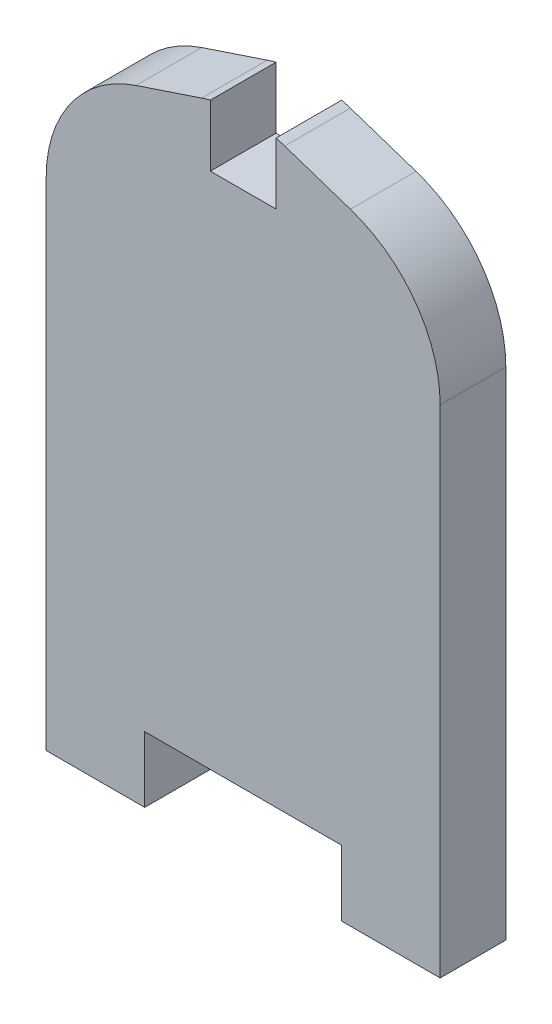
ISO-10303-21;
HEADER;
FILE_DESCRIPTION(('STEP AP214'),'2;1');
FILE_NAME('part.step','',(''),(''),'','','');
FILE_SCHEMA(('AUTOMOTIVE_DESIGN { 1 0 10303 214 1 1 1 1 }'));
ENDSEC;
DATA;
#1=APPLICATION_CONTEXT('core data for automotive mechanical design processes');
#2=APPLICATION_PROTOCOL_DEFINITION('international standard','automotive_design',2000,#1);
#3=PRODUCT_CONTEXT('',#1,'mechanical');
#4=PRODUCT('Part','Part','',(#3));
#5=PRODUCT_RELATED_PRODUCT_CATEGORY('part','',(#4));
#6=PRODUCT_DEFINITION_FORMATION('','',#4);
#7=PRODUCT_DEFINITION_CONTEXT('part definition',#1,'design');
#8=PRODUCT_DEFINITION('design','',#6,#7);
#9=PRODUCT_DEFINITION_SHAPE('','',#8);
#10=(LENGTH_UNIT() NAMED_UNIT(*) SI_UNIT(.MILLI.,.METRE.));
#11=(NAMED_UNIT(*) PLANE_ANGLE_UNIT() SI_UNIT($,.RADIAN.));
#12=(NAMED_UNIT(*) SI_UNIT($,.STERADIAN.) SOLID_ANGLE_UNIT());
#13=UNCERTAINTY_MEASURE_WITH_UNIT(LENGTH_MEASURE(1.E-05),#10,'distance_accuracy_value','');
#14=(GEOMETRIC_REPRESENTATION_CONTEXT(3) GLOBAL_UNCERTAINTY_ASSIGNED_CONTEXT((#13)) GLOBAL_UNIT_ASSIGNED_CONTEXT((#10,
#11,#12)) REPRESENTATION_CONTEXT('',''));
#15=CARTESIAN_POINT('',(0.,0.,0.));
#16=DIRECTION('',(0.,0.,1.));
#17=DIRECTION('',(1.,0.,0.));
#18=AXIS2_PLACEMENT_3D('',#15,#16,#17);
#19=CARTESIAN_POINT('',(0.,5.79395318214315,6.35));
#20=DIRECTION('',(0.,0.,-1.));
#21=DIRECTION('',(-1.,0.,0.));
#22=AXIS2_PLACEMENT_3D('',#19,#20,#21);
#23=CYLINDRICAL_SURFACE('',#22,12.7);
#24=DIRECTION('',(0.,0.,-1.));
#25=VECTOR('',#24,1.);
#26=CARTESIAN_POINT('',(3.175,18.0906753063517,6.35));
#27=LINE('',#26,#25);
#28=CARTESIAN_POINT('',(3.175,18.0906753063517,6.35));
#29=VERTEX_POINT('',#28);
#30=CARTESIAN_POINT('',(3.175,18.0906753063517,0.));
#31=VERTEX_POINT('',#30);
#32=EDGE_CURVE('E11',#29,#31,#27,.T.);
#33=ORIENTED_EDGE('',*,*,#32,.F.);
#34=CARTESIAN_POINT('',(0.,5.79395318214315,6.35));
#35=DIRECTION('',(0.,0.,1.));
#36=DIRECTION('',(1.,0.,0.));
#37=AXIS2_PLACEMENT_3D('',#34,#35,#36);
#38=CIRCLE('',#37,12.7);
#39=CARTESIAN_POINT('',(4.01609262841383,17.8422310673847,6.35));
#40=VERTEX_POINT('',#39);
#41=EDGE_CURVE('E294',#40,#29,#38,.T.);
#42=ORIENTED_EDGE('',*,*,#41,.F.);
#43=DIRECTION('',(0.,0.,-1.));
#44=VECTOR('',#43,1.);
#45=CARTESIAN_POINT('',(4.01609262841383,17.8422310673847,6.35));
#46=LINE('',#45,#44);
#47=CARTESIAN_POINT('',(4.01609262841383,17.8422310673847,0.));
#48=VERTEX_POINT('',#47);
#49=EDGE_CURVE('E274',#48,#40,#46,.F.);
#50=ORIENTED_EDGE('',*,*,#49,.F.);
#51=CARTESIAN_POINT('',(0.,5.79395318214315,0.));
#52=DIRECTION('',(0.,0.,1.));
#53=DIRECTION('',(1.,0.,0.));
#54=AXIS2_PLACEMENT_3D('',#51,#52,#53);
#55=CIRCLE('',#54,12.7);
#56=EDGE_CURVE('E281',#31,#48,#55,.F.);
#57=ORIENTED_EDGE('',*,*,#56,.F.);
#58=EDGE_LOOP('',(#33,#42,#50,#57));
#59=FACE_BOUND('',#58,.T.);
#60=ADVANCED_FACE('F39',(#59),#23,.T.);
#61=CARTESIAN_POINT('',(-19.05,-44.3190713898107,6.35));
#62=DIRECTION('',(0.,1.,0.));
#63=DIRECTION('',(0.,0.,1.));
#64=AXIS2_PLACEMENT_3D('',#61,#62,#63);
#65=PLANE('',#64);
#66=DIRECTION('',(1.,0.,0.));
#67=VECTOR('',#66,1.);
#68=CARTESIAN_POINT('',(-19.05,-44.3190713898107,0.));
#69=LINE('',#68,#67);
#70=CARTESIAN_POINT('',(-19.05,-44.3190713898107,0.));
#71=VERTEX_POINT('',#70);
#72=CARTESIAN_POINT('',(-9.52499999999999,-44.3190713898107,0.));
#73=VERTEX_POINT('',#72);
#74=EDGE_CURVE('E191',#71,#73,#69,.T.);
#75=ORIENTED_EDGE('',*,*,#74,.T.);
#76=DIRECTION('',(0.,0.,-1.));
#77=VECTOR('',#76,1.);
#78=CARTESIAN_POINT('',(-9.52499999999999,-44.3190713898107,6.35));
#79=LINE('',#78,#77);
#80=CARTESIAN_POINT('',(-9.52499999999999,-44.3190713898107,6.35));
#81=VERTEX_POINT('',#80);
#82=EDGE_CURVE('E266',#81,#73,#79,.T.);
#83=ORIENTED_EDGE('',*,*,#82,.F.);
#84=DIRECTION('',(1.,0.,0.));
#85=VECTOR('',#84,1.);
#86=CARTESIAN_POINT('',(-19.05,-44.3190713898107,6.35));
#87=LINE('',#86,#85);
#88=CARTESIAN_POINT('',(-19.05,-44.3190713898107,6.35));
#89=VERTEX_POINT('',#88);
#90=EDGE_CURVE('E195',#89,#81,#87,.T.);
#91=ORIENTED_EDGE('',*,*,#90,.F.);
#92=DIRECTION('',(0.,0.,-1.));
#93=VECTOR('',#92,1.);
#94=CARTESIAN_POINT('',(-19.05,-44.3190713898107,6.35));
#95=LINE('',#94,#93);
#96=EDGE_CURVE('E270',#89,#71,#95,.T.);
#97=ORIENTED_EDGE('',*,*,#96,.T.);
#98=EDGE_LOOP('',(#75,#83,#91,#97));
#99=FACE_BOUND('',#98,.T.);
#100=ADVANCED_FACE('F365',(#99),#65,.F.);
#101=CARTESIAN_POINT('',(-9.52499999999999,-37.9690713898107,6.35));
#102=DIRECTION('',(-1.,0.,0.));
#103=DIRECTION('',(0.,0.,1.));
#104=AXIS2_PLACEMENT_3D('',#101,#102,#103);
#105=PLANE('',#104);
#106=DIRECTION('',(0.,1.,0.));
#107=VECTOR('',#106,1.);
#108=CARTESIAN_POINT('',(-9.52499999999999,-37.9690713898107,0.));
#109=LINE('',#108,#107);
#110=CARTESIAN_POINT('',(-9.52499999999999,-37.9690713898107,0.));
#111=VERTEX_POINT('',#110);
#112=EDGE_CURVE('E225',#73,#111,#109,.T.);
#113=ORIENTED_EDGE('',*,*,#112,.T.);
#114=DIRECTION('',(0.,0.,-1.));
#115=VECTOR('',#114,1.);
#116=CARTESIAN_POINT('',(-9.52499999999999,-37.9690713898107,6.35));
#117=LINE('',#116,#115);
#118=CARTESIAN_POINT('',(-9.52499999999999,-37.9690713898107,6.35));
#119=VERTEX_POINT('',#118);
#120=EDGE_CURVE('E262',#119,#111,#117,.T.);
#121=ORIENTED_EDGE('',*,*,#120,.F.);
#122=DIRECTION('',(0.,1.,0.));
#123=VECTOR('',#122,1.);
#124=CARTESIAN_POINT('',(-9.52499999999999,-37.9690713898107,6.35));
#125=LINE('',#124,#123);
#126=EDGE_CURVE('E199',#81,#119,#125,.T.);
#127=ORIENTED_EDGE('',*,*,#126,.F.);
#128=ORIENTED_EDGE('',*,*,#82,.T.);
#129=EDGE_LOOP('',(#113,#121,#127,#128));
#130=FACE_BOUND('',#129,.T.);
#131=ADVANCED_FACE('F358',(#130),#105,.F.);
#132=CARTESIAN_POINT('',(-9.52499999999999,-37.9690713898107,6.35));
#133=DIRECTION('',(0.,1.,0.));
#134=DIRECTION('',(0.,0.,1.));
#135=AXIS2_PLACEMENT_3D('',#132,#133,#134);
#136=PLANE('',#135);
#137=DIRECTION('',(1.,0.,0.));
#138=VECTOR('',#137,1.);
#139=CARTESIAN_POINT('',(-9.52499999999999,-37.9690713898107,0.));
#140=LINE('',#139,#138);
#141=CARTESIAN_POINT('',(9.525,-37.9690713898107,0.));
#142=VERTEX_POINT('',#141);
#143=EDGE_CURVE('E228',#111,#142,#140,.T.);
#144=ORIENTED_EDGE('',*,*,#143,.T.);
#145=DIRECTION('',(0.,0.,-1.));
#146=VECTOR('',#145,1.);
#147=CARTESIAN_POINT('',(9.525,-37.9690713898107,6.35));
#148=LINE('',#147,#146);
#149=CARTESIAN_POINT('',(9.525,-37.9690713898107,6.35));
#150=VERTEX_POINT('',#149);
#151=EDGE_CURVE('E258',#150,#142,#148,.T.);
#152=ORIENTED_EDGE('',*,*,#151,.F.);
#153=DIRECTION('',(1.,0.,0.));
#154=VECTOR('',#153,1.);
#155=CARTESIAN_POINT('',(-9.52499999999999,-37.9690713898107,6.35));
#156=LINE('',#155,#154);
#157=EDGE_CURVE('E202',#119,#150,#156,.T.);
#158=ORIENTED_EDGE('',*,*,#157,.F.);
#159=ORIENTED_EDGE('',*,*,#120,.T.);
#160=EDGE_LOOP('',(#144,#152,#158,#159));
#161=FACE_BOUND('',#160,.T.);
#162=ADVANCED_FACE('F354',(#161),#136,.F.);
#163=CARTESIAN_POINT('',(9.525,-37.9690713898107,6.35));
#164=DIRECTION('',(1.,0.,0.));
#165=DIRECTION('',(0.,0.,-1.));
#166=AXIS2_PLACEMENT_3D('',#163,#164,#165);
#167=PLANE('',#166);
#168=DIRECTION('',(0.,-1.,0.));
#169=VECTOR('',#168,1.);
#170=CARTESIAN_POINT('',(9.525,-37.9690713898107,0.));
#171=LINE('',#170,#169);
#172=CARTESIAN_POINT('',(9.525,-44.3190713898107,0.));
#173=VERTEX_POINT('',#172);
#174=EDGE_CURVE('E231',#142,#173,#171,.T.);
#175=ORIENTED_EDGE('',*,*,#174,.T.);
#176=DIRECTION('',(0.,0.,-1.));
#177=VECTOR('',#176,1.);
#178=CARTESIAN_POINT('',(9.525,-44.3190713898107,6.35));
#179=LINE('',#178,#177);
#180=CARTESIAN_POINT('',(9.525,-44.3190713898107,6.35));
#181=VERTEX_POINT('',#180);
#182=EDGE_CURVE('E254',#181,#173,#179,.T.);
#183=ORIENTED_EDGE('',*,*,#182,.F.);
#184=DIRECTION('',(0.,-1.,0.));
#185=VECTOR('',#184,1.);
#186=CARTESIAN_POINT('',(9.525,-37.9690713898107,6.35));
#187=LINE('',#186,#185);
#188=EDGE_CURVE('E205',#150,#181,#187,.T.);
#189=ORIENTED_EDGE('',*,*,#188,.F.);
#190=ORIENTED_EDGE('',*,*,#151,.T.);
#191=EDGE_LOOP('',(#175,#183,#189,#190));
#192=FACE_BOUND('',#191,.T.);
#193=ADVANCED_FACE('F349',(#192),#167,.F.);
#194=CARTESIAN_POINT('',(19.05,-44.3190713898107,6.35));
#195=DIRECTION('',(0.,1.,0.));
#196=DIRECTION('',(-1.,0.,0.));
#197=AXIS2_PLACEMENT_3D('',#194,#195,#196);
#198=PLANE('',#197);
#199=DIRECTION('',(1.,0.,0.));
#200=VECTOR('',#199,1.);
#201=CARTESIAN_POINT('',(19.05,-44.3190713898107,0.));
#202=LINE('',#201,#200);
#203=CARTESIAN_POINT('',(19.05,-44.3190713898107,0.));
#204=VERTEX_POINT('',#203);
#205=EDGE_CURVE('E234',#173,#204,#202,.T.);
#206=ORIENTED_EDGE('',*,*,#205,.T.);
#207=DIRECTION('',(0.,0.,-1.));
#208=VECTOR('',#207,1.);
#209=CARTESIAN_POINT('',(19.05,-44.3190713898107,6.35));
#210=LINE('',#209,#208);
#211=CARTESIAN_POINT('',(19.05,-44.3190713898107,6.35));
#212=VERTEX_POINT('',#211);
#213=EDGE_CURVE('E222',#212,#204,#210,.T.);
#214=ORIENTED_EDGE('',*,*,#213,.F.);
#215=DIRECTION('',(1.,0.,0.));
#216=VECTOR('',#215,1.);
#217=CARTESIAN_POINT('',(19.05,-44.3190713898107,6.35));
#218=LINE('',#217,#216);
#219=EDGE_CURVE('E208',#181,#212,#218,.T.);
#220=ORIENTED_EDGE('',*,*,#219,.F.);
#221=ORIENTED_EDGE('',*,*,#182,.T.);
#222=EDGE_LOOP('',(#206,#214,#220,#221));
#223=FACE_BOUND('',#222,.T.);
#224=ADVANCED_FACE('F343',(#223),#198,.F.);
#225=CARTESIAN_POINT('',(19.05,-37.9690713898107,6.35));
#226=DIRECTION('',(-1.,0.,0.));
#227=DIRECTION('',(0.,-1.,0.));
#228=AXIS2_PLACEMENT_3D('',#225,#226,#227);
#229=PLANE('',#228);
#230=DIRECTION('',(0.,1.,0.));
#231=VECTOR('',#230,1.);
#232=CARTESIAN_POINT('',(19.05,-37.9690713898107,0.));
#233=LINE('',#232,#231);
#234=CARTESIAN_POINT('',(19.05,3.67728651547648,0.));
#235=VERTEX_POINT('',#234);
#236=EDGE_CURVE('E238',#204,#235,#233,.T.);
#237=ORIENTED_EDGE('',*,*,#236,.T.);
#238=DIRECTION('',(0.,0.,-1.));
#239=VECTOR('',#238,1.);
#240=CARTESIAN_POINT('',(19.05,3.67728651547648,6.35));
#241=LINE('',#240,#239);
#242=CARTESIAN_POINT('',(19.0499999999999,3.67728651547647,6.35));
#243=VERTEX_POINT('',#242);
#244=EDGE_CURVE('E290',#235,#243,#241,.F.);
#245=ORIENTED_EDGE('',*,*,#244,.T.);
#246=DIRECTION('',(0.,1.,0.));
#247=VECTOR('',#246,1.);
#248=CARTESIAN_POINT('',(19.05,-37.9690713898107,6.35));
#249=LINE('',#248,#247);
#250=EDGE_CURVE('E211',#212,#243,#249,.T.);
#251=ORIENTED_EDGE('',*,*,#250,.F.);
#252=ORIENTED_EDGE('',*,*,#213,.T.);
#253=EDGE_LOOP('',(#237,#245,#251,#252));
#254=FACE_BOUND('',#253,.T.);
#255=ADVANCED_FACE('F338',(#254),#229,.F.);
#256=CARTESIAN_POINT('',(0.,19.1809286101893,6.35));
#257=DIRECTION('',(-0.316227766016838,-0.948683298050514,0.));
#258=DIRECTION('',(0.948683298050514,-0.316227766016838,0.));
#259=AXIS2_PLACEMENT_3D('',#256,#257,#258);
#260=PLANE('',#259);
#261=DIRECTION('',(-0.948683298050514,0.316227766016838,0.));
#262=VECTOR('',#261,1.);
#263=CARTESIAN_POINT('',(0.,19.1809286101893,6.35));
#264=LINE('',#263,#262);
#265=CARTESIAN_POINT('',(10.3660926284138,15.725564400718,6.35));
#266=VERTEX_POINT('',#265);
#267=EDGE_CURVE('E215',#266,#40,#264,.T.);
#268=ORIENTED_EDGE('',*,*,#267,.F.);
#269=DIRECTION('',(0.,0.,-1.));
#270=VECTOR('',#269,1.);
#271=CARTESIAN_POINT('',(10.3660926284138,15.725564400718,6.35));
#272=LINE('',#271,#270);
#273=CARTESIAN_POINT('',(10.3660926284138,15.725564400718,0.));
#274=VERTEX_POINT('',#273);
#275=EDGE_CURVE('E277',#266,#274,#272,.T.);
#276=ORIENTED_EDGE('',*,*,#275,.T.);
#277=DIRECTION('',(-0.948683298050514,0.316227766016838,0.));
#278=VECTOR('',#277,1.);
#279=CARTESIAN_POINT('',(0.,19.1809286101893,0.));
#280=LINE('',#279,#278);
#281=EDGE_CURVE('E242',#274,#48,#280,.T.);
#282=ORIENTED_EDGE('',*,*,#281,.T.);
#283=ORIENTED_EDGE('',*,*,#49,.T.);
#284=EDGE_LOOP('',(#268,#276,#282,#283));
#285=FACE_BOUND('',#284,.T.);
#286=ADVANCED_FACE('F329',(#285),#260,.F.);
#287=CARTESIAN_POINT('',(-19.05,12.8309286101893,6.35));
#288=DIRECTION('',(0.316227766016838,-0.948683298050514,0.));
#289=DIRECTION('',(0.948683298050514,0.316227766016838,0.));
#290=AXIS2_PLACEMENT_3D('',#287,#288,#289);
#291=PLANE('',#290);
#292=DIRECTION('',(-0.948683298050514,-0.316227766016838,0.));
#293=VECTOR('',#292,1.);
#294=CARTESIAN_POINT('',(-19.05,12.8309286101893,0.));
#295=LINE('',#294,#293);
#296=CARTESIAN_POINT('',(-4.01609262841385,17.8422310673847,0.));
#297=VERTEX_POINT('',#296);
#298=CARTESIAN_POINT('',(-10.3660926284138,15.725564400718,0.));
#299=VERTEX_POINT('',#298);
#300=EDGE_CURVE('E246',#297,#299,#295,.T.);
#301=ORIENTED_EDGE('',*,*,#300,.T.);
#302=DIRECTION('',(0.,0.,-1.));
#303=VECTOR('',#302,1.);
#304=CARTESIAN_POINT('',(-10.3660926284138,15.725564400718,6.35));
#305=LINE('',#304,#303);
#306=CARTESIAN_POINT('',(-10.3660926284138,15.725564400718,6.35));
#307=VERTEX_POINT('',#306);
#308=EDGE_CURVE('E63',#299,#307,#305,.F.);
#309=ORIENTED_EDGE('',*,*,#308,.T.);
#310=DIRECTION('',(-0.948683298050514,-0.316227766016838,0.));
#311=VECTOR('',#310,1.);
#312=CARTESIAN_POINT('',(-19.05,12.8309286101893,6.35));
#313=LINE('',#312,#311);
#314=CARTESIAN_POINT('',(-4.01609262841385,17.8422310673847,6.35));
#315=VERTEX_POINT('',#314);
#316=EDGE_CURVE('E219',#315,#307,#313,.T.);
#317=ORIENTED_EDGE('',*,*,#316,.F.);
#318=DIRECTION('',(0.,0.,-1.));
#319=VECTOR('',#318,1.);
#320=CARTESIAN_POINT('',(-4.01609262841385,17.8422310673847,6.35));
#321=LINE('',#320,#319);
#322=EDGE_CURVE('E308',#315,#297,#321,.T.);
#323=ORIENTED_EDGE('',*,*,#322,.T.);
#324=EDGE_LOOP('',(#301,#309,#317,#323));
#325=FACE_BOUND('',#324,.T.);
#326=ADVANCED_FACE('F373',(#325),#291,.F.);
#327=CARTESIAN_POINT('',(-19.05,-37.9690713898107,6.35));
#328=DIRECTION('',(1.,0.,0.));
#329=DIRECTION('',(0.,1.,0.));
#330=AXIS2_PLACEMENT_3D('',#327,#328,#329);
#331=PLANE('',#330);
#332=DIRECTION('',(0.,-1.,0.));
#333=VECTOR('',#332,1.);
#334=CARTESIAN_POINT('',(-19.05,-37.9690713898107,6.35));
#335=LINE('',#334,#333);
#336=CARTESIAN_POINT('',(-19.0499999999999,3.67728651547646,6.35));
#337=VERTEX_POINT('',#336);
#338=EDGE_CURVE('E192',#337,#89,#335,.T.);
#339=ORIENTED_EDGE('',*,*,#338,.F.);
#340=DIRECTION('',(0.,0.,-1.));
#341=VECTOR('',#340,1.);
#342=CARTESIAN_POINT('',(-19.05,3.67728651547648,6.35));
#343=LINE('',#342,#341);
#344=CARTESIAN_POINT('',(-19.05,3.67728651547648,0.));
#345=VERTEX_POINT('',#344);
#346=EDGE_CURVE('E304',#337,#345,#343,.T.);
#347=ORIENTED_EDGE('',*,*,#346,.T.);
#348=DIRECTION('',(0.,-1.,0.));
#349=VECTOR('',#348,1.);
#350=CARTESIAN_POINT('',(-19.05,-37.9690713898107,0.));
#351=LINE('',#350,#349);
#352=EDGE_CURVE('E196',#345,#71,#351,.T.);
#353=ORIENTED_EDGE('',*,*,#352,.T.);
#354=ORIENTED_EDGE('',*,*,#96,.F.);
#355=EDGE_LOOP('',(#339,#347,#353,#354));
#356=FACE_BOUND('',#355,.T.);
#357=ADVANCED_FACE('F368',(#356),#331,.F.);
#358=CARTESIAN_POINT('',(0.,0.,6.35));
#359=DIRECTION('',(0.,0.,1.));
#360=DIRECTION('',(1.,0.,0.));
#361=AXIS2_PLACEMENT_3D('',#358,#359,#360);
#362=PLANE('',#361);
#363=DIRECTION('',(0.,1.,0.));
#364=VECTOR('',#363,1.);
#365=CARTESIAN_POINT('',(3.175,0.,6.35));
#366=LINE('',#365,#364);
#367=CARTESIAN_POINT('',(3.175,12.1439531821432,6.35));
#368=VERTEX_POINT('',#367);
#369=EDGE_CURVE('E185',#368,#29,#366,.T.);
#370=ORIENTED_EDGE('',*,*,#369,.F.);
#371=DIRECTION('',(1.,0.,0.));
#372=VECTOR('',#371,1.);
#373=CARTESIAN_POINT('',(0.,12.1439531821432,6.35));
#374=LINE('',#373,#372);
#375=CARTESIAN_POINT('',(-3.175,12.1439531821432,6.35));
#376=VERTEX_POINT('',#375);
#377=EDGE_CURVE('E188',#376,#368,#374,.T.);
#378=ORIENTED_EDGE('',*,*,#377,.F.);
#379=DIRECTION('',(0.,-1.,0.));
#380=VECTOR('',#379,1.);
#381=CARTESIAN_POINT('',(-3.175,0.,6.35));
#382=LINE('',#381,#380);
#383=CARTESIAN_POINT('',(-3.175,18.0906753063517,6.35));
#384=VERTEX_POINT('',#383);
#385=EDGE_CURVE('E156',#384,#376,#382,.T.);
#386=ORIENTED_EDGE('',*,*,#385,.F.);
#387=EDGE_CURVE('E293',#384,#315,#38,.T.);
#388=ORIENTED_EDGE('',*,*,#387,.T.);
#389=ORIENTED_EDGE('',*,*,#316,.T.);
#390=CARTESIAN_POINT('',(-6.35,3.67728651547648,6.35));
#391=DIRECTION('',(0.,0.,1.));
#392=DIRECTION('',(1.,0.,0.));
#393=AXIS2_PLACEMENT_3D('',#390,#391,#392);
#394=CIRCLE('',#393,12.7);
#395=EDGE_CURVE('E298',#307,#337,#394,.T.);
#396=ORIENTED_EDGE('',*,*,#395,.T.);
#397=ORIENTED_EDGE('',*,*,#338,.T.);
#398=ORIENTED_EDGE('',*,*,#90,.T.);
#399=ORIENTED_EDGE('',*,*,#126,.T.);
#400=ORIENTED_EDGE('',*,*,#157,.T.);
#401=ORIENTED_EDGE('',*,*,#188,.T.);
#402=ORIENTED_EDGE('',*,*,#219,.T.);
#403=ORIENTED_EDGE('',*,*,#250,.T.);
#404=CARTESIAN_POINT('',(6.35,3.67728651547648,6.35));
#405=DIRECTION('',(0.,0.,1.));
#406=DIRECTION('',(1.,0.,0.));
#407=AXIS2_PLACEMENT_3D('',#404,#405,#406);
#408=CIRCLE('',#407,12.7);
#409=EDGE_CURVE('E301',#243,#266,#408,.T.);
#410=ORIENTED_EDGE('',*,*,#409,.T.);
#411=ORIENTED_EDGE('',*,*,#267,.T.);
#412=ORIENTED_EDGE('',*,*,#41,.T.);
#413=EDGE_LOOP('',(#370,#378,#386,#388,#389,#396,#397,#398,#399,#400,#401,#402,#403,#410,#411,#412));
#414=FACE_BOUND('',#413,.T.);
#415=ADVANCED_FACE('F318',(#414),#362,.T.);
#416=CARTESIAN_POINT('',(0.,0.,0.));
#417=DIRECTION('',(0.,0.,1.));
#418=DIRECTION('',(1.,0.,0.));
#419=AXIS2_PLACEMENT_3D('',#416,#417,#418);
#420=PLANE('',#419);
#421=DIRECTION('',(1.,0.,0.));
#422=VECTOR('',#421,1.);
#423=CARTESIAN_POINT('',(-3.175,12.1439531821432,0.));
#424=LINE('',#423,#422);
#425=CARTESIAN_POINT('',(-3.175,12.1439531821432,0.));
#426=VERTEX_POINT('',#425);
#427=CARTESIAN_POINT('',(3.175,12.1439531821432,0.));
#428=VERTEX_POINT('',#427);
#429=EDGE_CURVE('E161',#426,#428,#424,.T.);
#430=ORIENTED_EDGE('',*,*,#429,.T.);
#431=DIRECTION('',(0.,1.,0.));
#432=VECTOR('',#431,1.);
#433=CARTESIAN_POINT('',(3.175,12.1439531821432,0.));
#434=LINE('',#433,#432);
#435=EDGE_CURVE('E176',#428,#31,#434,.T.);
#436=ORIENTED_EDGE('',*,*,#435,.T.);
#437=ORIENTED_EDGE('',*,*,#56,.T.);
#438=ORIENTED_EDGE('',*,*,#281,.F.);
#439=CARTESIAN_POINT('',(6.35,3.67728651547648,0.));
#440=DIRECTION('',(0.,0.,1.));
#441=DIRECTION('',(1.,0.,0.));
#442=AXIS2_PLACEMENT_3D('',#439,#440,#441);
#443=CIRCLE('',#442,12.7);
#444=EDGE_CURVE('E287',#274,#235,#443,.F.);
#445=ORIENTED_EDGE('',*,*,#444,.T.);
#446=ORIENTED_EDGE('',*,*,#236,.F.);
#447=ORIENTED_EDGE('',*,*,#205,.F.);
#448=ORIENTED_EDGE('',*,*,#174,.F.);
#449=ORIENTED_EDGE('',*,*,#143,.F.);
#450=ORIENTED_EDGE('',*,*,#112,.F.);
#451=ORIENTED_EDGE('',*,*,#74,.F.);
#452=ORIENTED_EDGE('',*,*,#352,.F.);
#453=CARTESIAN_POINT('',(-6.35,3.67728651547648,0.));
#454=DIRECTION('',(0.,0.,1.));
#455=DIRECTION('',(1.,0.,0.));
#456=AXIS2_PLACEMENT_3D('',#453,#454,#455);
#457=CIRCLE('',#456,12.7);
#458=EDGE_CURVE('E284',#345,#299,#457,.F.);
#459=ORIENTED_EDGE('',*,*,#458,.T.);
#460=ORIENTED_EDGE('',*,*,#300,.F.);
#461=CARTESIAN_POINT('',(-3.175,18.0906753063517,0.));
#462=VERTEX_POINT('',#461);
#463=EDGE_CURVE('E174',#297,#462,#55,.F.);
#464=ORIENTED_EDGE('',*,*,#463,.T.);
#465=DIRECTION('',(0.,-1.,0.));
#466=VECTOR('',#465,1.);
#467=CARTESIAN_POINT('',(-3.175,12.1439531821432,0.));
#468=LINE('',#467,#466);
#469=EDGE_CURVE('E55',#462,#426,#468,.T.);
#470=ORIENTED_EDGE('',*,*,#469,.T.);
#471=EDGE_LOOP('',(#430,#436,#437,#438,#445,#446,#447,#448,#449,#450,#451,#452,#459,#460,#464,#470));
#472=FACE_BOUND('',#471,.T.);
#473=ADVANCED_FACE('F172',(#472),#420,.F.);
#474=CARTESIAN_POINT('',(6.35,3.67728651547648,6.35));
#475=DIRECTION('',(0.,0.,-1.));
#476=DIRECTION('',(-1.,0.,0.));
#477=AXIS2_PLACEMENT_3D('',#474,#475,#476);
#478=CYLINDRICAL_SURFACE('',#477,12.7);
#479=ORIENTED_EDGE('',*,*,#409,.F.);
#480=ORIENTED_EDGE('',*,*,#244,.F.);
#481=ORIENTED_EDGE('',*,*,#444,.F.);
#482=ORIENTED_EDGE('',*,*,#275,.F.);
#483=EDGE_LOOP('',(#479,#480,#481,#482));
#484=FACE_BOUND('',#483,.T.);
#485=ADVANCED_FACE('F334',(#484),#478,.T.);
#486=CARTESIAN_POINT('',(-6.35,3.67728651547648,6.35));
#487=DIRECTION('',(0.,0.,-1.));
#488=DIRECTION('',(-1.,0.,0.));
#489=AXIS2_PLACEMENT_3D('',#486,#487,#488);
#490=CYLINDRICAL_SURFACE('',#489,12.7);
#491=ORIENTED_EDGE('',*,*,#395,.F.);
#492=ORIENTED_EDGE('',*,*,#308,.F.);
#493=ORIENTED_EDGE('',*,*,#458,.F.);
#494=ORIENTED_EDGE('',*,*,#346,.F.);
#495=EDGE_LOOP('',(#491,#492,#493,#494));
#496=FACE_BOUND('',#495,.T.);
#497=ADVANCED_FACE('F372',(#496),#490,.T.);
#498=DIRECTION('',(0.,0.,-1.));
#499=VECTOR('',#498,1.);
#500=CARTESIAN_POINT('',(-3.175,18.0906753063517,6.35));
#501=LINE('',#500,#499);
#502=EDGE_CURVE('E48',#462,#384,#501,.F.);
#503=ORIENTED_EDGE('',*,*,#502,.F.);
#504=ORIENTED_EDGE('',*,*,#463,.F.);
#505=ORIENTED_EDGE('',*,*,#322,.F.);
#506=ORIENTED_EDGE('',*,*,#387,.F.);
#507=EDGE_LOOP('',(#503,#504,#505,#506));
#508=FACE_BOUND('',#507,.T.);
#509=ADVANCED_FACE('F41',(#508),#23,.T.);
#510=CARTESIAN_POINT('',(3.175,12.1439531821432,0.));
#511=DIRECTION('',(1.,0.,0.));
#512=DIRECTION('',(0.,0.,-1.));
#513=AXIS2_PLACEMENT_3D('',#510,#511,#512);
#514=PLANE('',#513);
#515=ORIENTED_EDGE('',*,*,#369,.T.);
#516=ORIENTED_EDGE('',*,*,#32,.T.);
#517=ORIENTED_EDGE('',*,*,#435,.F.);
#518=DIRECTION('',(0.,0.,1.));
#519=VECTOR('',#518,1.);
#520=CARTESIAN_POINT('',(3.175,12.1439531821432,0.));
#521=LINE('',#520,#519);
#522=EDGE_CURVE('E160',#428,#368,#521,.T.);
#523=ORIENTED_EDGE('',*,*,#522,.T.);
#524=EDGE_LOOP('',(#515,#516,#517,#523));
#525=FACE_BOUND('',#524,.T.);
#526=ADVANCED_FACE('F388',(#525),#514,.F.);
#527=CARTESIAN_POINT('',(-3.175,12.1439531821432,0.));
#528=DIRECTION('',(0.,-1.,0.));
#529=DIRECTION('',(1.,0.,0.));
#530=AXIS2_PLACEMENT_3D('',#527,#528,#529);
#531=PLANE('',#530);
#532=ORIENTED_EDGE('',*,*,#377,.T.);
#533=ORIENTED_EDGE('',*,*,#522,.F.);
#534=ORIENTED_EDGE('',*,*,#429,.F.);
#535=DIRECTION('',(0.,0.,1.));
#536=VECTOR('',#535,1.);
#537=CARTESIAN_POINT('',(-3.175,12.1439531821432,0.));
#538=LINE('',#537,#536);
#539=EDGE_CURVE('E152',#426,#376,#538,.T.);
#540=ORIENTED_EDGE('',*,*,#539,.T.);
#541=EDGE_LOOP('',(#532,#533,#534,#540));
#542=FACE_BOUND('',#541,.T.);
#543=ADVANCED_FACE('F164',(#542),#531,.F.);
#544=CARTESIAN_POINT('',(-3.175,12.1439531821432,0.));
#545=DIRECTION('',(-1.,0.,0.));
#546=DIRECTION('',(0.,0.,1.));
#547=AXIS2_PLACEMENT_3D('',#544,#545,#546);
#548=PLANE('',#547);
#549=ORIENTED_EDGE('',*,*,#385,.T.);
#550=ORIENTED_EDGE('',*,*,#539,.F.);
#551=ORIENTED_EDGE('',*,*,#469,.F.);
#552=ORIENTED_EDGE('',*,*,#502,.T.);
#553=EDGE_LOOP('',(#549,#550,#551,#552));
#554=FACE_BOUND('',#553,.T.);
#555=ADVANCED_FACE('F154',(#554),#548,.F.);
#556=CLOSED_SHELL('',(#60,#100,#131,#162,#193,#224,#255,#286,#326,#357,#415,#473,#485,#497,#509,
#526,#543,#555));
#557=MANIFOLD_SOLID_BREP('B2',#556);
#558=ADVANCED_BREP_SHAPE_REPRESENTATION('',(#18,#557),#14);
#559=SHAPE_DEFINITION_REPRESENTATION(#9,#558);
ENDSEC;
END-ISO-10303-21;
